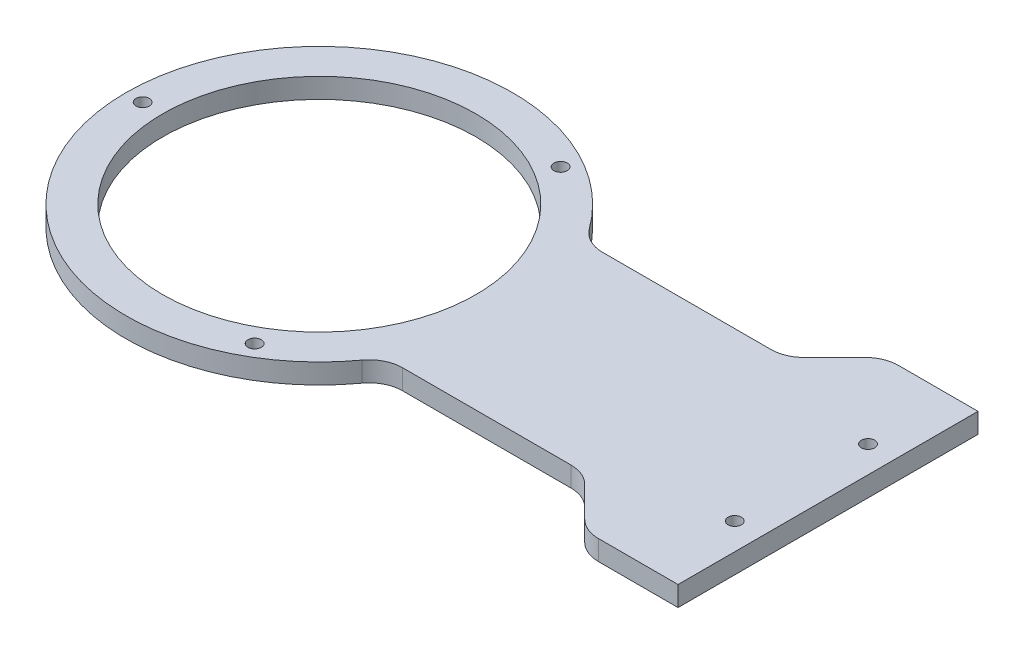
ISO-10303-21;
HEADER;
FILE_DESCRIPTION(('STEP AP214'),'2;1');
FILE_NAME('part.step','',(''),(''),'','','');
FILE_SCHEMA(('AUTOMOTIVE_DESIGN { 1 0 10303 214 1 1 1 1 }'));
ENDSEC;
DATA;
#1=APPLICATION_CONTEXT('core data for automotive mechanical design processes');
#2=APPLICATION_PROTOCOL_DEFINITION('international standard','automotive_design',2000,#1);
#3=PRODUCT_CONTEXT('',#1,'mechanical');
#4=PRODUCT('Part','Part','',(#3));
#5=PRODUCT_RELATED_PRODUCT_CATEGORY('part','',(#4));
#6=PRODUCT_DEFINITION_FORMATION('','',#4);
#7=PRODUCT_DEFINITION_CONTEXT('part definition',#1,'design');
#8=PRODUCT_DEFINITION('design','',#6,#7);
#9=PRODUCT_DEFINITION_SHAPE('','',#8);
#10=(LENGTH_UNIT() NAMED_UNIT(*) SI_UNIT(.MILLI.,.METRE.));
#11=(NAMED_UNIT(*) PLANE_ANGLE_UNIT() SI_UNIT($,.RADIAN.));
#12=(NAMED_UNIT(*) SI_UNIT($,.STERADIAN.) SOLID_ANGLE_UNIT());
#13=UNCERTAINTY_MEASURE_WITH_UNIT(LENGTH_MEASURE(1.E-05),#10,'distance_accuracy_value','');
#14=(GEOMETRIC_REPRESENTATION_CONTEXT(3) GLOBAL_UNCERTAINTY_ASSIGNED_CONTEXT((#13)) GLOBAL_UNIT_ASSIGNED_CONTEXT((#10,
#11,#12)) REPRESENTATION_CONTEXT('',''));
#15=CARTESIAN_POINT('',(0.,0.,0.));
#16=DIRECTION('',(0.,0.,1.));
#17=DIRECTION('',(1.,0.,0.));
#18=AXIS2_PLACEMENT_3D('',#15,#16,#17);
#19=CARTESIAN_POINT('',(0.,3.,-15.));
#20=DIRECTION('',(0.,0.,-1.));
#21=DIRECTION('',(-1.,0.,0.));
#22=AXIS2_PLACEMENT_3D('',#19,#20,#21);
#23=PLANE('',#22);
#24=DIRECTION('',(1.,0.,0.));
#25=VECTOR('',#24,1.);
#26=CARTESIAN_POINT('',(0.,0.,-15.));
#27=LINE('',#26,#25);
#28=CARTESIAN_POINT('',(27.495454169735,0.,-15.));
#29=VERTEX_POINT('',#28);
#30=CARTESIAN_POINT('',(52.7482794801162,0.,-15.));
#31=VERTEX_POINT('',#30);
#32=EDGE_CURVE('E199',#29,#31,#27,.T.);
#33=ORIENTED_EDGE('',*,*,#32,.F.);
#34=DIRECTION('',(0.,-1.,0.));
#35=VECTOR('',#34,1.);
#36=CARTESIAN_POINT('',(27.495454169735,3.,-15.));
#37=LINE('',#36,#35);
#38=CARTESIAN_POINT('',(27.495454169735,3.,-15.));
#39=VERTEX_POINT('',#38);
#40=EDGE_CURVE('E253',#29,#39,#37,.F.);
#41=ORIENTED_EDGE('',*,*,#40,.T.);
#42=DIRECTION('',(1.,0.,0.));
#43=VECTOR('',#42,1.);
#44=CARTESIAN_POINT('',(0.,3.,-15.));
#45=LINE('',#44,#43);
#46=CARTESIAN_POINT('',(52.7482794801162,3.,-15.));
#47=VERTEX_POINT('',#46);
#48=EDGE_CURVE('E240',#39,#47,#45,.T.);
#49=ORIENTED_EDGE('',*,*,#48,.T.);
#50=DIRECTION('',(0.,-1.,0.));
#51=VECTOR('',#50,1.);
#52=CARTESIAN_POINT('',(52.7482794801162,0.,-15.));
#53=LINE('',#52,#51);
#54=EDGE_CURVE('E249',#47,#31,#53,.T.);
#55=ORIENTED_EDGE('',*,*,#54,.T.);
#56=EDGE_LOOP('',(#33,#41,#49,#55));
#57=FACE_BOUND('',#56,.T.);
#58=ADVANCED_FACE('F45',(#57),#23,.T.);
#59=CARTESIAN_POINT('',(0.,3.,0.));
#60=DIRECTION('',(0.,-1.,0.));
#61=DIRECTION('',(0.,0.,-1.));
#62=AXIS2_PLACEMENT_3D('',#59,#60,#61);
#63=CYLINDRICAL_SURFACE('',#62,29.);
#64=CARTESIAN_POINT('',(0.,3.,0.));
#65=DIRECTION('',(0.,1.,0.));
#66=DIRECTION('',(0.,0.,1.));
#67=AXIS2_PLACEMENT_3D('',#64,#65,#66);
#68=CIRCLE('',#67,29.);
#69=CARTESIAN_POINT('',(23.4520050271269,3.,-17.0588235294118));
#70=VERTEX_POINT('',#69);
#71=CARTESIAN_POINT('',(23.4520050271269,3.,17.0588235294118));
#72=VERTEX_POINT('',#71);
#73=EDGE_CURVE('E331',#70,#72,#68,.T.);
#74=ORIENTED_EDGE('',*,*,#73,.F.);
#75=DIRECTION('',(0.,-1.,0.));
#76=VECTOR('',#75,1.);
#77=CARTESIAN_POINT('',(23.4520050271269,3.,-17.0588235294118));
#78=LINE('',#77,#76);
#79=CARTESIAN_POINT('',(23.4520050271269,0.,-17.0588235294118));
#80=VERTEX_POINT('',#79);
#81=EDGE_CURVE('E245',#70,#80,#78,.T.);
#82=ORIENTED_EDGE('',*,*,#81,.T.);
#83=CARTESIAN_POINT('',(0.,0.,0.));
#84=DIRECTION('',(0.,1.,0.));
#85=DIRECTION('',(0.,0.,1.));
#86=AXIS2_PLACEMENT_3D('',#83,#84,#85);
#87=CIRCLE('',#86,29.);
#88=CARTESIAN_POINT('',(23.4520050271269,0.,17.0588235294118));
#89=VERTEX_POINT('',#88);
#90=EDGE_CURVE('E203',#80,#89,#87,.T.);
#91=ORIENTED_EDGE('',*,*,#90,.T.);
#92=DIRECTION('',(0.,-1.,0.));
#93=VECTOR('',#92,1.);
#94=CARTESIAN_POINT('',(23.4520050271269,3.,17.0588235294118));
#95=LINE('',#94,#93);
#96=EDGE_CURVE('E161',#89,#72,#95,.F.);
#97=ORIENTED_EDGE('',*,*,#96,.T.);
#98=EDGE_LOOP('',(#74,#82,#91,#97));
#99=FACE_BOUND('',#98,.T.);
#100=ADVANCED_FACE('F387',(#99),#63,.T.);
#101=CARTESIAN_POINT('',(0.,3.,15.));
#102=DIRECTION('',(0.,0.,-1.));
#103=DIRECTION('',(-1.,0.,0.));
#104=AXIS2_PLACEMENT_3D('',#101,#102,#103);
#105=PLANE('',#104);
#106=DIRECTION('',(1.,0.,0.));
#107=VECTOR('',#106,1.);
#108=CARTESIAN_POINT('',(0.,3.,15.));
#109=LINE('',#108,#107);
#110=CARTESIAN_POINT('',(27.495454169735,3.,15.));
#111=VERTEX_POINT('',#110);
#112=CARTESIAN_POINT('',(52.7482794801163,3.,15.));
#113=VERTEX_POINT('',#112);
#114=EDGE_CURVE('E325',#111,#113,#109,.T.);
#115=ORIENTED_EDGE('',*,*,#114,.F.);
#116=DIRECTION('',(0.,1.,0.));
#117=VECTOR('',#116,1.);
#118=CARTESIAN_POINT('',(27.495454169735,0.,15.));
#119=LINE('',#118,#117);
#120=CARTESIAN_POINT('',(27.495454169735,0.,15.));
#121=VERTEX_POINT('',#120);
#122=EDGE_CURVE('E259',#111,#121,#119,.F.);
#123=ORIENTED_EDGE('',*,*,#122,.T.);
#124=DIRECTION('',(1.,0.,0.));
#125=VECTOR('',#124,1.);
#126=CARTESIAN_POINT('',(0.,0.,15.));
#127=LINE('',#126,#125);
#128=CARTESIAN_POINT('',(52.7482794801163,0.,15.));
#129=VERTEX_POINT('',#128);
#130=EDGE_CURVE('E208',#121,#129,#127,.T.);
#131=ORIENTED_EDGE('',*,*,#130,.T.);
#132=DIRECTION('',(0.,-1.,0.));
#133=VECTOR('',#132,1.);
#134=CARTESIAN_POINT('',(52.7482794801163,3.,15.));
#135=LINE('',#134,#133);
#136=EDGE_CURVE('E256',#129,#113,#135,.F.);
#137=ORIENTED_EDGE('',*,*,#136,.T.);
#138=EDGE_LOOP('',(#115,#123,#131,#137));
#139=FACE_BOUND('',#138,.T.);
#140=ADVANCED_FACE('F320',(#139),#105,.F.);
#141=CARTESIAN_POINT('',(19.9096736459906,3.,-19.9096736459908));
#142=DIRECTION('',(-0.707106781186544,0.,0.707106781186551));
#143=DIRECTION('',(0.707106781186551,0.,0.707106781186544));
#144=AXIS2_PLACEMENT_3D('',#141,#142,#143);
#145=PLANE('',#144);
#146=DIRECTION('',(-0.707106781186551,0.,-0.707106781186544));
#147=VECTOR('',#146,1.);
#148=CARTESIAN_POINT('',(19.9096736459906,0.,-19.9096736459908));
#149=LINE('',#148,#147);
#150=CARTESIAN_POINT('',(60.8548811979145,0.,21.0355339059327));
#151=VERTEX_POINT('',#150);
#152=CARTESIAN_POINT('',(56.283813386049,0.,16.4644660940673));
#153=VERTEX_POINT('',#152);
#154=EDGE_CURVE('E212',#151,#153,#149,.T.);
#155=ORIENTED_EDGE('',*,*,#154,.F.);
#156=DIRECTION('',(0.,-1.,0.));
#157=VECTOR('',#156,1.);
#158=CARTESIAN_POINT('',(60.8548811979145,3.,21.0355339059327));
#159=LINE('',#158,#157);
#160=CARTESIAN_POINT('',(60.8548811979145,3.,21.0355339059327));
#161=VERTEX_POINT('',#160);
#162=EDGE_CURVE('E276',#151,#161,#159,.F.);
#163=ORIENTED_EDGE('',*,*,#162,.T.);
#164=DIRECTION('',(-0.707106781186551,0.,-0.707106781186544));
#165=VECTOR('',#164,1.);
#166=CARTESIAN_POINT('',(19.9096736459906,3.,-19.9096736459908));
#167=LINE('',#166,#165);
#168=CARTESIAN_POINT('',(56.283813386049,3.,16.4644660940673));
#169=VERTEX_POINT('',#168);
#170=EDGE_CURVE('E172',#161,#169,#167,.T.);
#171=ORIENTED_EDGE('',*,*,#170,.T.);
#172=DIRECTION('',(0.,-1.,0.));
#173=VECTOR('',#172,1.);
#174=CARTESIAN_POINT('',(56.283813386049,3.,16.4644660940672));
#175=LINE('',#174,#173);
#176=EDGE_CURVE('E272',#169,#153,#175,.T.);
#177=ORIENTED_EDGE('',*,*,#176,.T.);
#178=EDGE_LOOP('',(#155,#163,#171,#177));
#179=FACE_BOUND('',#178,.T.);
#180=ADVANCED_FACE('F327',(#179),#145,.T.);
#181=CARTESIAN_POINT('',(0.,3.,22.5));
#182=DIRECTION('',(0.,0.,1.));
#183=DIRECTION('',(1.,0.,0.));
#184=AXIS2_PLACEMENT_3D('',#181,#182,#183);
#185=PLANE('',#184);
#186=DIRECTION('',(-1.,0.,0.));
#187=VECTOR('',#186,1.);
#188=CARTESIAN_POINT('',(0.,3.,22.5));
#189=LINE('',#188,#187);
#190=CARTESIAN_POINT('',(76.3193472919817,3.,22.4999999999999));
#191=VERTEX_POINT('',#190);
#192=CARTESIAN_POINT('',(64.3904151038472,3.,22.4999999999999));
#193=VERTEX_POINT('',#192);
#194=EDGE_CURVE('E152',#191,#193,#189,.T.);
#195=ORIENTED_EDGE('',*,*,#194,.T.);
#196=DIRECTION('',(0.,-1.,0.));
#197=VECTOR('',#196,1.);
#198=CARTESIAN_POINT('',(64.3904151038472,3.,22.4999999999999));
#199=LINE('',#198,#197);
#200=CARTESIAN_POINT('',(64.3904151038472,0.,22.4999999999999));
#201=VERTEX_POINT('',#200);
#202=EDGE_CURVE('E263',#193,#201,#199,.T.);
#203=ORIENTED_EDGE('',*,*,#202,.T.);
#204=DIRECTION('',(-1.,0.,0.));
#205=VECTOR('',#204,1.);
#206=CARTESIAN_POINT('',(0.,0.,22.5));
#207=LINE('',#206,#205);
#208=CARTESIAN_POINT('',(76.3193472919817,0.,22.4999999999999));
#209=VERTEX_POINT('',#208);
#210=EDGE_CURVE('E155',#209,#201,#207,.T.);
#211=ORIENTED_EDGE('',*,*,#210,.F.);
#212=DIRECTION('',(0.,-1.,0.));
#213=VECTOR('',#212,1.);
#214=CARTESIAN_POINT('',(76.3193472919817,3.,22.4999999999999));
#215=LINE('',#214,#213);
#216=EDGE_CURVE('E148',#191,#209,#215,.T.);
#217=ORIENTED_EDGE('',*,*,#216,.F.);
#218=EDGE_LOOP('',(#195,#203,#211,#217));
#219=FACE_BOUND('',#218,.T.);
#220=ADVANCED_FACE('F150',(#219),#185,.T.);
#221=CARTESIAN_POINT('',(76.3193472919817,3.,0.));
#222=DIRECTION('',(1.,0.,0.));
#223=DIRECTION('',(0.,0.,-1.));
#224=AXIS2_PLACEMENT_3D('',#221,#222,#223);
#225=PLANE('',#224);
#226=DIRECTION('',(0.,0.,1.));
#227=VECTOR('',#226,1.);
#228=CARTESIAN_POINT('',(76.3193472919817,0.,0.));
#229=LINE('',#228,#227);
#230=CARTESIAN_POINT('',(76.3193472919818,0.,-22.5000000000001));
#231=VERTEX_POINT('',#230);
#232=EDGE_CURVE('E218',#231,#209,#229,.T.);
#233=ORIENTED_EDGE('',*,*,#232,.F.);
#234=DIRECTION('',(0.,-1.,0.));
#235=VECTOR('',#234,1.);
#236=CARTESIAN_POINT('',(76.3193472919818,3.,-22.5000000000001));
#237=LINE('',#236,#235);
#238=CARTESIAN_POINT('',(76.3193472919818,3.,-22.5000000000001));
#239=VERTEX_POINT('',#238);
#240=EDGE_CURVE('E162',#239,#231,#237,.T.);
#241=ORIENTED_EDGE('',*,*,#240,.F.);
#242=DIRECTION('',(0.,0.,1.));
#243=VECTOR('',#242,1.);
#244=CARTESIAN_POINT('',(76.3193472919817,3.,0.));
#245=LINE('',#244,#243);
#246=EDGE_CURVE('E168',#239,#191,#245,.T.);
#247=ORIENTED_EDGE('',*,*,#246,.T.);
#248=ORIENTED_EDGE('',*,*,#216,.T.);
#249=EDGE_LOOP('',(#233,#241,#247,#248));
#250=FACE_BOUND('',#249,.T.);
#251=ADVANCED_FACE('F175',(#250),#225,.T.);
#252=CARTESIAN_POINT('',(0.,3.,-22.5));
#253=DIRECTION('',(0.,0.,-1.));
#254=DIRECTION('',(-1.,0.,0.));
#255=AXIS2_PLACEMENT_3D('',#252,#253,#254);
#256=PLANE('',#255);
#257=DIRECTION('',(1.,0.,0.));
#258=VECTOR('',#257,1.);
#259=CARTESIAN_POINT('',(0.,0.,-22.5));
#260=LINE('',#259,#258);
#261=CARTESIAN_POINT('',(64.3904151038472,0.,-22.5000000000001));
#262=VERTEX_POINT('',#261);
#263=EDGE_CURVE('E221',#262,#231,#260,.T.);
#264=ORIENTED_EDGE('',*,*,#263,.F.);
#265=DIRECTION('',(0.,-1.,0.));
#266=VECTOR('',#265,1.);
#267=CARTESIAN_POINT('',(64.3904151038472,3.,-22.5000000000001));
#268=LINE('',#267,#266);
#269=CARTESIAN_POINT('',(64.3904151038472,3.,-22.5000000000001));
#270=VERTEX_POINT('',#269);
#271=EDGE_CURVE('E289',#262,#270,#268,.F.);
#272=ORIENTED_EDGE('',*,*,#271,.T.);
#273=DIRECTION('',(1.,0.,0.));
#274=VECTOR('',#273,1.);
#275=CARTESIAN_POINT('',(0.,3.,-22.5));
#276=LINE('',#275,#274);
#277=EDGE_CURVE('E178',#270,#239,#276,.T.);
#278=ORIENTED_EDGE('',*,*,#277,.T.);
#279=ORIENTED_EDGE('',*,*,#240,.T.);
#280=EDGE_LOOP('',(#264,#272,#278,#279));
#281=FACE_BOUND('',#280,.T.);
#282=ADVANCED_FACE('F432',(#281),#256,.T.);
#283=CARTESIAN_POINT('',(72.3193472919817,3.,-10.0000000000001));
#284=DIRECTION('',(0.,-1.,0.));
#285=DIRECTION('',(0.,0.,-1.));
#286=AXIS2_PLACEMENT_3D('',#283,#284,#285);
#287=CYLINDRICAL_SURFACE('',#286,0.999999999999998);
#288=CARTESIAN_POINT('',(72.3193472919817,3.,-10.0000000000001));
#289=DIRECTION('',(0.,1.,0.));
#290=DIRECTION('',(0.,0.,1.));
#291=AXIS2_PLACEMENT_3D('',#288,#289,#290);
#292=CIRCLE('',#291,0.999999999999998);
#293=CARTESIAN_POINT('',(72.3193472919817,3.,-9.00000000000006));
#294=VERTEX_POINT('',#293);
#295=EDGE_CURVE('E191',#294,#294,#292,.T.);
#296=ORIENTED_EDGE('',*,*,#295,.T.);
#297=EDGE_LOOP('',(#296));
#298=FACE_BOUND('',#297,.T.);
#299=CARTESIAN_POINT('',(72.3193472919817,0.,-10.0000000000001));
#300=DIRECTION('',(0.,1.,0.));
#301=DIRECTION('',(0.,0.,1.));
#302=AXIS2_PLACEMENT_3D('',#299,#300,#301);
#303=CIRCLE('',#302,0.999999999999998);
#304=CARTESIAN_POINT('',(72.3193472919817,0.,-9.00000000000006));
#305=VERTEX_POINT('',#304);
#306=EDGE_CURVE('E232',#305,#305,#303,.T.);
#307=ORIENTED_EDGE('',*,*,#306,.F.);
#308=EDGE_LOOP('',(#307));
#309=FACE_BOUND('',#308,.T.);
#310=ADVANCED_FACE('F434',(#298,#309),#287,.F.);
#311=CARTESIAN_POINT('',(0.,3.,0.));
#312=DIRECTION('',(0.,-1.,0.));
#313=DIRECTION('',(0.,0.,-1.));
#314=AXIS2_PLACEMENT_3D('',#311,#312,#313);
#315=CYLINDRICAL_SURFACE('',#314,23.5);
#316=CARTESIAN_POINT('',(0.,3.,0.));
#317=DIRECTION('',(0.,1.,0.));
#318=DIRECTION('',(0.,0.,1.));
#319=AXIS2_PLACEMENT_3D('',#316,#317,#318);
#320=CIRCLE('',#319,23.5);
#321=CARTESIAN_POINT('',(0.,3.,23.5));
#322=VERTEX_POINT('',#321);
#323=EDGE_CURVE('E187',#322,#322,#320,.T.);
#324=ORIENTED_EDGE('',*,*,#323,.T.);
#325=EDGE_LOOP('',(#324));
#326=FACE_BOUND('',#325,.T.);
#327=CARTESIAN_POINT('',(0.,0.,0.));
#328=DIRECTION('',(0.,1.,0.));
#329=DIRECTION('',(0.,0.,1.));
#330=AXIS2_PLACEMENT_3D('',#327,#328,#329);
#331=CIRCLE('',#330,23.5);
#332=CARTESIAN_POINT('',(0.,0.,23.5));
#333=VERTEX_POINT('',#332);
#334=EDGE_CURVE('E228',#333,#333,#331,.T.);
#335=ORIENTED_EDGE('',*,*,#334,.F.);
#336=EDGE_LOOP('',(#335));
#337=FACE_BOUND('',#336,.T.);
#338=ADVANCED_FACE('F440',(#326,#337),#315,.F.);
#339=CARTESIAN_POINT('',(19.9096736459909,3.,19.9096736459909));
#340=DIRECTION('',(-0.707106781186548,0.,-0.707106781186547));
#341=DIRECTION('',(-0.707106781186547,0.,0.707106781186548));
#342=AXIS2_PLACEMENT_3D('',#339,#340,#341);
#343=PLANE('',#342);
#344=DIRECTION('',(0.707106781186547,0.,-0.707106781186548));
#345=VECTOR('',#344,1.);
#346=CARTESIAN_POINT('',(19.9096736459909,3.,19.9096736459909));
#347=LINE('',#346,#345);
#348=CARTESIAN_POINT('',(56.283813386049,3.,-16.4644660940673));
#349=VERTEX_POINT('',#348);
#350=CARTESIAN_POINT('',(60.8548811979145,3.,-21.0355339059328));
#351=VERTEX_POINT('',#350);
#352=EDGE_CURVE('E181',#349,#351,#347,.T.);
#353=ORIENTED_EDGE('',*,*,#352,.T.);
#354=DIRECTION('',(0.,-1.,0.));
#355=VECTOR('',#354,1.);
#356=CARTESIAN_POINT('',(60.8548811979145,3.,-21.0355339059328));
#357=LINE('',#356,#355);
#358=CARTESIAN_POINT('',(60.8548811979145,0.,-21.0355339059328));
#359=VERTEX_POINT('',#358);
#360=EDGE_CURVE('E285',#351,#359,#357,.T.);
#361=ORIENTED_EDGE('',*,*,#360,.T.);
#362=DIRECTION('',(0.707106781186547,0.,-0.707106781186548));
#363=VECTOR('',#362,1.);
#364=CARTESIAN_POINT('',(19.9096736459909,0.,19.9096736459909));
#365=LINE('',#364,#363);
#366=CARTESIAN_POINT('',(56.283813386049,0.,-16.4644660940673));
#367=VERTEX_POINT('',#366);
#368=EDGE_CURVE('E224',#367,#359,#365,.T.);
#369=ORIENTED_EDGE('',*,*,#368,.F.);
#370=DIRECTION('',(0.,-1.,0.));
#371=VECTOR('',#370,1.);
#372=CARTESIAN_POINT('',(56.283813386049,3.,-16.4644660940673));
#373=LINE('',#372,#371);
#374=EDGE_CURVE('E68',#367,#349,#373,.F.);
#375=ORIENTED_EDGE('',*,*,#374,.T.);
#376=EDGE_LOOP('',(#353,#361,#369,#375));
#377=FACE_BOUND('',#376,.T.);
#378=ADVANCED_FACE('F427',(#377),#343,.T.);
#379=CARTESIAN_POINT('',(72.3193472919817,3.,10.0000000000001));
#380=DIRECTION('',(0.,-1.,0.));
#381=DIRECTION('',(0.,0.,-1.));
#382=AXIS2_PLACEMENT_3D('',#379,#380,#381);
#383=CYLINDRICAL_SURFACE('',#382,0.999999999999998);
#384=CARTESIAN_POINT('',(72.3193472919817,3.,10.0000000000001));
#385=DIRECTION('',(0.,1.,0.));
#386=DIRECTION('',(0.,0.,1.));
#387=AXIS2_PLACEMENT_3D('',#384,#385,#386);
#388=CIRCLE('',#387,0.999999999999998);
#389=CARTESIAN_POINT('',(72.3193472919817,3.,11.0000000000001));
#390=VERTEX_POINT('',#389);
#391=EDGE_CURVE('E195',#390,#390,#388,.F.);
#392=ORIENTED_EDGE('',*,*,#391,.F.);
#393=EDGE_LOOP('',(#392));
#394=FACE_BOUND('',#393,.T.);
#395=CARTESIAN_POINT('',(72.3193472919817,0.,10.0000000000001));
#396=DIRECTION('',(0.,1.,0.));
#397=DIRECTION('',(0.,0.,1.));
#398=AXIS2_PLACEMENT_3D('',#395,#396,#397);
#399=CIRCLE('',#398,0.999999999999998);
#400=CARTESIAN_POINT('',(72.3193472919817,0.,11.0000000000001));
#401=VERTEX_POINT('',#400);
#402=EDGE_CURVE('E236',#401,#401,#399,.F.);
#403=ORIENTED_EDGE('',*,*,#402,.T.);
#404=EDGE_LOOP('',(#403));
#405=FACE_BOUND('',#404,.T.);
#406=ADVANCED_FACE('F368',(#394,#405),#383,.F.);
#407=CARTESIAN_POINT('',(0.,3.,0.));
#408=DIRECTION('',(0.,1.,0.));
#409=DIRECTION('',(0.,0.,1.));
#410=AXIS2_PLACEMENT_3D('',#407,#408,#409);
#411=PLANE('',#410);
#412=CARTESIAN_POINT('',(-26.5,3.,1.92554305833426E-13));
#413=DIRECTION('',(0.,1.,0.));
#414=DIRECTION('',(0.866025403784436,0.,-0.500000000000004));
#415=AXIS2_PLACEMENT_3D('',#412,#413,#414);
#416=CIRCLE('',#415,1.);
#417=CARTESIAN_POINT('',(-25.6339745962156,3.,-0.499999999999812));
#418=VERTEX_POINT('',#417);
#419=EDGE_CURVE('E352',#418,#418,#416,.T.);
#420=ORIENTED_EDGE('',*,*,#419,.F.);
#421=EDGE_LOOP('',(#420));
#422=FACE_BOUND('',#421,.T.);
#423=CARTESIAN_POINT('',(13.2500000000003,3.,22.9496732002875));
#424=DIRECTION('',(0.,1.,0.));
#425=DIRECTION('',(-0.866025403784443,0.,-0.499999999999992));
#426=AXIS2_PLACEMENT_3D('',#423,#424,#425);
#427=CIRCLE('',#426,1.);
#428=CARTESIAN_POINT('',(13.2500000000003,3.,23.9496732002875));
#429=VERTEX_POINT('',#428);
#430=EDGE_CURVE('E353',#429,#429,#427,.T.);
#431=ORIENTED_EDGE('',*,*,#430,.F.);
#432=EDGE_LOOP('',(#431));
#433=FACE_BOUND('',#432,.T.);
#434=CARTESIAN_POINT('',(13.2499999999999,3.,-22.9496732002877));
#435=DIRECTION('',(0.,1.,0.));
#436=DIRECTION('',(0.,0.,1.));
#437=AXIS2_PLACEMENT_3D('',#434,#435,#436);
#438=CIRCLE('',#437,1.);
#439=CARTESIAN_POINT('',(13.2499999999999,3.,-21.9496732002877));
#440=VERTEX_POINT('',#439);
#441=EDGE_CURVE('E343',#440,#440,#438,.T.);
#442=ORIENTED_EDGE('',*,*,#441,.F.);
#443=EDGE_LOOP('',(#442));
#444=FACE_BOUND('',#443,.T.);
#445=ORIENTED_EDGE('',*,*,#170,.F.);
#446=CARTESIAN_POINT('',(64.3904151038472,3.,17.4999999999999));
#447=DIRECTION('',(0.,1.,0.));
#448=DIRECTION('',(0.,0.,1.));
#449=AXIS2_PLACEMENT_3D('',#446,#447,#448);
#450=CIRCLE('',#449,5.);
#451=EDGE_CURVE('E170',#161,#193,#450,.T.);
#452=ORIENTED_EDGE('',*,*,#451,.T.);
#453=ORIENTED_EDGE('',*,*,#194,.F.);
#454=ORIENTED_EDGE('',*,*,#246,.F.);
#455=ORIENTED_EDGE('',*,*,#277,.F.);
#456=CARTESIAN_POINT('',(64.3904151038472,3.,-17.5000000000001));
#457=DIRECTION('',(0.,1.,0.));
#458=DIRECTION('',(0.,0.,1.));
#459=AXIS2_PLACEMENT_3D('',#456,#457,#458);
#460=CIRCLE('',#459,5.);
#461=EDGE_CURVE('E61',#270,#351,#460,.T.);
#462=ORIENTED_EDGE('',*,*,#461,.T.);
#463=ORIENTED_EDGE('',*,*,#352,.F.);
#464=CARTESIAN_POINT('',(52.7482794801162,3.,-20.));
#465=DIRECTION('',(0.,1.,0.));
#466=DIRECTION('',(0.,0.,1.));
#467=AXIS2_PLACEMENT_3D('',#464,#465,#466);
#468=CIRCLE('',#467,5.);
#469=EDGE_CURVE('E307',#349,#47,#468,.F.);
#470=ORIENTED_EDGE('',*,*,#469,.T.);
#471=ORIENTED_EDGE('',*,*,#48,.F.);
#472=CARTESIAN_POINT('',(27.495454169735,3.,-20.));
#473=DIRECTION('',(0.,1.,0.));
#474=DIRECTION('',(0.,0.,1.));
#475=AXIS2_PLACEMENT_3D('',#472,#473,#474);
#476=CIRCLE('',#475,5.);
#477=EDGE_CURVE('E295',#39,#70,#476,.F.);
#478=ORIENTED_EDGE('',*,*,#477,.T.);
#479=ORIENTED_EDGE('',*,*,#73,.T.);
#480=CARTESIAN_POINT('',(27.495454169735,3.,20.));
#481=DIRECTION('',(0.,1.,0.));
#482=DIRECTION('',(0.,0.,1.));
#483=AXIS2_PLACEMENT_3D('',#480,#481,#482);
#484=CIRCLE('',#483,5.);
#485=EDGE_CURVE('E301',#72,#111,#484,.F.);
#486=ORIENTED_EDGE('',*,*,#485,.T.);
#487=ORIENTED_EDGE('',*,*,#114,.T.);
#488=CARTESIAN_POINT('',(52.7482794801163,3.,20.));
#489=DIRECTION('',(0.,1.,0.));
#490=DIRECTION('',(0.,0.,1.));
#491=AXIS2_PLACEMENT_3D('',#488,#489,#490);
#492=CIRCLE('',#491,5.);
#493=EDGE_CURVE('E11',#113,#169,#492,.F.);
#494=ORIENTED_EDGE('',*,*,#493,.T.);
#495=EDGE_LOOP('',(#445,#452,#453,#454,#455,#462,#463,#470,#471,#478,#479,#486,#487,#494));
#496=FACE_BOUND('',#495,.T.);
#497=ORIENTED_EDGE('',*,*,#323,.F.);
#498=EDGE_LOOP('',(#497));
#499=FACE_BOUND('',#498,.T.);
#500=ORIENTED_EDGE('',*,*,#295,.F.);
#501=EDGE_LOOP('',(#500));
#502=FACE_BOUND('',#501,.T.);
#503=ORIENTED_EDGE('',*,*,#391,.T.);
#504=EDGE_LOOP('',(#503));
#505=FACE_BOUND('',#504,.T.);
#506=ADVANCED_FACE('F166',(#422,#433,#444,#496,#499,#502,#505),#411,.T.);
#507=CARTESIAN_POINT('',(0.,0.,0.));
#508=DIRECTION('',(0.,1.,0.));
#509=DIRECTION('',(0.,0.,1.));
#510=AXIS2_PLACEMENT_3D('',#507,#508,#509);
#511=PLANE('',#510);
#512=CARTESIAN_POINT('',(-26.5,0.,1.92554305833426E-13));
#513=DIRECTION('',(0.,1.,0.));
#514=DIRECTION('',(0.,0.,1.));
#515=AXIS2_PLACEMENT_3D('',#512,#513,#514);
#516=CIRCLE('',#515,1.);
#517=CARTESIAN_POINT('',(-26.5,0.,1.00000000000019));
#518=VERTEX_POINT('',#517);
#519=EDGE_CURVE('E347',#518,#518,#516,.F.);
#520=ORIENTED_EDGE('',*,*,#519,.F.);
#521=EDGE_LOOP('',(#520));
#522=FACE_BOUND('',#521,.T.);
#523=CARTESIAN_POINT('',(13.2500000000003,0.,22.9496732002875));
#524=DIRECTION('',(0.,1.,0.));
#525=DIRECTION('',(0.,0.,1.));
#526=AXIS2_PLACEMENT_3D('',#523,#524,#525);
#527=CIRCLE('',#526,1.);
#528=CARTESIAN_POINT('',(13.2500000000003,0.,23.9496732002875));
#529=VERTEX_POINT('',#528);
#530=EDGE_CURVE('E348',#529,#529,#527,.F.);
#531=ORIENTED_EDGE('',*,*,#530,.F.);
#532=EDGE_LOOP('',(#531));
#533=FACE_BOUND('',#532,.T.);
#534=CARTESIAN_POINT('',(13.2499999999999,0.,-22.9496732002877));
#535=DIRECTION('',(0.,1.,0.));
#536=DIRECTION('',(0.,0.,1.));
#537=AXIS2_PLACEMENT_3D('',#534,#535,#536);
#538=CIRCLE('',#537,1.);
#539=CARTESIAN_POINT('',(13.2499999999999,0.,-21.9496732002877));
#540=VERTEX_POINT('',#539);
#541=EDGE_CURVE('E204',#540,#540,#538,.F.);
#542=ORIENTED_EDGE('',*,*,#541,.F.);
#543=EDGE_LOOP('',(#542));
#544=FACE_BOUND('',#543,.T.);
#545=ORIENTED_EDGE('',*,*,#210,.T.);
#546=CARTESIAN_POINT('',(64.3904151038472,0.,17.4999999999999));
#547=DIRECTION('',(0.,1.,0.));
#548=DIRECTION('',(0.,0.,1.));
#549=AXIS2_PLACEMENT_3D('',#546,#547,#548);
#550=CIRCLE('',#549,5.);
#551=EDGE_CURVE('E269',#201,#151,#550,.F.);
#552=ORIENTED_EDGE('',*,*,#551,.T.);
#553=ORIENTED_EDGE('',*,*,#154,.T.);
#554=CARTESIAN_POINT('',(52.7482794801163,0.,20.));
#555=DIRECTION('',(0.,1.,0.));
#556=DIRECTION('',(0.,0.,1.));
#557=AXIS2_PLACEMENT_3D('',#554,#555,#556);
#558=CIRCLE('',#557,5.);
#559=EDGE_CURVE('E54',#153,#129,#558,.T.);
#560=ORIENTED_EDGE('',*,*,#559,.T.);
#561=ORIENTED_EDGE('',*,*,#130,.F.);
#562=CARTESIAN_POINT('',(27.495454169735,0.,20.));
#563=DIRECTION('',(0.,1.,0.));
#564=DIRECTION('',(0.,0.,1.));
#565=AXIS2_PLACEMENT_3D('',#562,#563,#564);
#566=CIRCLE('',#565,5.);
#567=EDGE_CURVE('E298',#121,#89,#566,.T.);
#568=ORIENTED_EDGE('',*,*,#567,.T.);
#569=ORIENTED_EDGE('',*,*,#90,.F.);
#570=CARTESIAN_POINT('',(27.495454169735,0.,-20.));
#571=DIRECTION('',(0.,1.,0.));
#572=DIRECTION('',(0.,0.,1.));
#573=AXIS2_PLACEMENT_3D('',#570,#571,#572);
#574=CIRCLE('',#573,5.);
#575=EDGE_CURVE('E292',#80,#29,#574,.T.);
#576=ORIENTED_EDGE('',*,*,#575,.T.);
#577=ORIENTED_EDGE('',*,*,#32,.T.);
#578=CARTESIAN_POINT('',(52.7482794801162,0.,-20.));
#579=DIRECTION('',(0.,1.,0.));
#580=DIRECTION('',(0.,0.,1.));
#581=AXIS2_PLACEMENT_3D('',#578,#579,#580);
#582=CIRCLE('',#581,5.);
#583=EDGE_CURVE('E304',#31,#367,#582,.T.);
#584=ORIENTED_EDGE('',*,*,#583,.T.);
#585=ORIENTED_EDGE('',*,*,#368,.T.);
#586=CARTESIAN_POINT('',(64.3904151038472,0.,-17.5000000000001));
#587=DIRECTION('',(0.,1.,0.));
#588=DIRECTION('',(0.,0.,1.));
#589=AXIS2_PLACEMENT_3D('',#586,#587,#588);
#590=CIRCLE('',#589,5.);
#591=EDGE_CURVE('E266',#359,#262,#590,.F.);
#592=ORIENTED_EDGE('',*,*,#591,.T.);
#593=ORIENTED_EDGE('',*,*,#263,.T.);
#594=ORIENTED_EDGE('',*,*,#232,.T.);
#595=EDGE_LOOP('',(#545,#552,#553,#560,#561,#568,#569,#576,#577,#584,#585,#592,#593,#594));
#596=FACE_BOUND('',#595,.T.);
#597=ORIENTED_EDGE('',*,*,#334,.T.);
#598=EDGE_LOOP('',(#597));
#599=FACE_BOUND('',#598,.T.);
#600=ORIENTED_EDGE('',*,*,#306,.T.);
#601=EDGE_LOOP('',(#600));
#602=FACE_BOUND('',#601,.T.);
#603=ORIENTED_EDGE('',*,*,#402,.F.);
#604=EDGE_LOOP('',(#603));
#605=FACE_BOUND('',#604,.T.);
#606=ADVANCED_FACE('F312',(#522,#533,#544,#596,#599,#602,#605),#511,.F.);
#607=CARTESIAN_POINT('',(27.495454169735,3.,-20.));
#608=DIRECTION('',(0.,-1.,0.));
#609=DIRECTION('',(0.,0.,-1.));
#610=AXIS2_PLACEMENT_3D('',#607,#608,#609);
#611=CYLINDRICAL_SURFACE('',#610,5.);
#612=ORIENTED_EDGE('',*,*,#477,.F.);
#613=ORIENTED_EDGE('',*,*,#40,.F.);
#614=ORIENTED_EDGE('',*,*,#575,.F.);
#615=ORIENTED_EDGE('',*,*,#81,.F.);
#616=EDGE_LOOP('',(#612,#613,#614,#615));
#617=FACE_BOUND('',#616,.T.);
#618=ADVANCED_FACE('F398',(#617),#611,.F.);
#619=CARTESIAN_POINT('',(27.495454169735,3.,20.));
#620=DIRECTION('',(0.,-1.,0.));
#621=DIRECTION('',(0.,0.,-1.));
#622=AXIS2_PLACEMENT_3D('',#619,#620,#621);
#623=CYLINDRICAL_SURFACE('',#622,5.);
#624=ORIENTED_EDGE('',*,*,#485,.F.);
#625=ORIENTED_EDGE('',*,*,#96,.F.);
#626=ORIENTED_EDGE('',*,*,#567,.F.);
#627=ORIENTED_EDGE('',*,*,#122,.F.);
#628=EDGE_LOOP('',(#624,#625,#626,#627));
#629=FACE_BOUND('',#628,.T.);
#630=ADVANCED_FACE('F401',(#629),#623,.F.);
#631=CARTESIAN_POINT('',(64.3904151038472,3.,17.4999999999999));
#632=DIRECTION('',(0.,-1.,0.));
#633=DIRECTION('',(0.,0.,-1.));
#634=AXIS2_PLACEMENT_3D('',#631,#632,#633);
#635=CYLINDRICAL_SURFACE('',#634,5.);
#636=ORIENTED_EDGE('',*,*,#451,.F.);
#637=ORIENTED_EDGE('',*,*,#162,.F.);
#638=ORIENTED_EDGE('',*,*,#551,.F.);
#639=ORIENTED_EDGE('',*,*,#202,.F.);
#640=EDGE_LOOP('',(#636,#637,#638,#639));
#641=FACE_BOUND('',#640,.T.);
#642=ADVANCED_FACE('F405',(#641),#635,.T.);
#643=CARTESIAN_POINT('',(64.3904151038472,3.,-17.5000000000001));
#644=DIRECTION('',(0.,-1.,0.));
#645=DIRECTION('',(0.,0.,-1.));
#646=AXIS2_PLACEMENT_3D('',#643,#644,#645);
#647=CYLINDRICAL_SURFACE('',#646,5.);
#648=ORIENTED_EDGE('',*,*,#461,.F.);
#649=ORIENTED_EDGE('',*,*,#271,.F.);
#650=ORIENTED_EDGE('',*,*,#591,.F.);
#651=ORIENTED_EDGE('',*,*,#360,.F.);
#652=EDGE_LOOP('',(#648,#649,#650,#651));
#653=FACE_BOUND('',#652,.T.);
#654=ADVANCED_FACE('F409',(#653),#647,.T.);
#655=CARTESIAN_POINT('',(52.7482794801162,3.,-20.));
#656=DIRECTION('',(0.,1.,0.));
#657=DIRECTION('',(0.,0.,1.));
#658=AXIS2_PLACEMENT_3D('',#655,#656,#657);
#659=CYLINDRICAL_SURFACE('',#658,5.);
#660=ORIENTED_EDGE('',*,*,#469,.F.);
#661=ORIENTED_EDGE('',*,*,#374,.F.);
#662=ORIENTED_EDGE('',*,*,#583,.F.);
#663=ORIENTED_EDGE('',*,*,#54,.F.);
#664=EDGE_LOOP('',(#660,#661,#662,#663));
#665=FACE_BOUND('',#664,.T.);
#666=ADVANCED_FACE('F385',(#665),#659,.F.);
#667=CARTESIAN_POINT('',(52.7482794801163,3.,20.));
#668=DIRECTION('',(0.,-1.,0.));
#669=DIRECTION('',(0.,0.,-1.));
#670=AXIS2_PLACEMENT_3D('',#667,#668,#669);
#671=CYLINDRICAL_SURFACE('',#670,5.);
#672=ORIENTED_EDGE('',*,*,#493,.F.);
#673=ORIENTED_EDGE('',*,*,#136,.F.);
#674=ORIENTED_EDGE('',*,*,#559,.F.);
#675=ORIENTED_EDGE('',*,*,#176,.F.);
#676=EDGE_LOOP('',(#672,#673,#674,#675));
#677=FACE_BOUND('',#676,.T.);
#678=ADVANCED_FACE('F47',(#677),#671,.F.);
#679=CARTESIAN_POINT('',(13.2499999999999,-2.8284271247462,-22.9496732002877));
#680=DIRECTION('',(0.,1.,0.));
#681=DIRECTION('',(0.,0.,1.));
#682=AXIS2_PLACEMENT_3D('',#679,#680,#681);
#683=CYLINDRICAL_SURFACE('',#682,1.);
#684=ORIENTED_EDGE('',*,*,#541,.T.);
#685=EDGE_LOOP('',(#684));
#686=FACE_BOUND('',#685,.T.);
#687=ORIENTED_EDGE('',*,*,#441,.T.);
#688=EDGE_LOOP('',(#687));
#689=FACE_BOUND('',#688,.T.);
#690=ADVANCED_FACE('F374',(#686,#689),#683,.F.);
#691=CARTESIAN_POINT('',(13.2500000000003,-2.82842712474619,22.9496732002875));
#692=DIRECTION('',(0.,1.,0.));
#693=DIRECTION('',(0.,0.,1.));
#694=AXIS2_PLACEMENT_3D('',#691,#692,#693);
#695=CYLINDRICAL_SURFACE('',#694,1.);
#696=CARTESIAN_POINT('',(13.2500000000003,0.,23.9496732002875));
#697=CARTESIAN_POINT('',(13.2500000000003,0.0312499999999996,23.9496732002875));
#698=CARTESIAN_POINT('',(13.2500000000003,0.0624999999999996,23.9496732002875));
#699=CARTESIAN_POINT('',(13.2500000000003,0.125,23.9496732002875));
#700=CARTESIAN_POINT('',(13.2500000000003,0.15625,23.9496732002875));
#701=CARTESIAN_POINT('',(13.2500000000003,0.21875,23.9496732002875));
#702=CARTESIAN_POINT('',(13.2500000000003,0.25,23.9496732002875));
#703=CARTESIAN_POINT('',(13.2500000000003,0.3125,23.9496732002875));
#704=CARTESIAN_POINT('',(13.2500000000003,0.34375,23.9496732002875));
#705=CARTESIAN_POINT('',(13.2500000000003,0.40625,23.9496732002875));
#706=CARTESIAN_POINT('',(13.2500000000003,0.4375,23.9496732002875));
#707=CARTESIAN_POINT('',(13.2500000000003,0.5,23.9496732002875));
#708=CARTESIAN_POINT('',(13.2500000000003,0.53125,23.9496732002875));
#709=CARTESIAN_POINT('',(13.2500000000003,0.59375,23.9496732002875));
#710=CARTESIAN_POINT('',(13.2500000000003,0.625,23.9496732002875));
#711=CARTESIAN_POINT('',(13.2500000000003,0.6875,23.9496732002875));
#712=CARTESIAN_POINT('',(13.2500000000003,0.71875,23.9496732002875));
#713=CARTESIAN_POINT('',(13.2500000000003,0.78125,23.9496732002875));
#714=CARTESIAN_POINT('',(13.2500000000003,0.8125,23.9496732002875));
#715=CARTESIAN_POINT('',(13.2500000000003,0.875,23.9496732002875));
#716=CARTESIAN_POINT('',(13.2500000000003,0.90625,23.9496732002875));
#717=CARTESIAN_POINT('',(13.2500000000003,0.96875,23.9496732002875));
#718=CARTESIAN_POINT('',(13.2500000000003,1.,23.9496732002875));
#719=CARTESIAN_POINT('',(13.2500000000003,1.0625,23.9496732002875));
#720=CARTESIAN_POINT('',(13.2500000000003,1.09375,23.9496732002875));
#721=CARTESIAN_POINT('',(13.2500000000003,1.15625,23.9496732002875));
#722=CARTESIAN_POINT('',(13.2500000000003,1.1875,23.9496732002875));
#723=CARTESIAN_POINT('',(13.2500000000003,1.25,23.9496732002875));
#724=CARTESIAN_POINT('',(13.2500000000003,1.28125,23.9496732002875));
#725=CARTESIAN_POINT('',(13.2500000000003,1.34375,23.9496732002875));
#726=CARTESIAN_POINT('',(13.2500000000003,1.375,23.9496732002875));
#727=CARTESIAN_POINT('',(13.2500000000003,1.4375,23.9496732002875));
#728=CARTESIAN_POINT('',(13.2500000000003,1.46875,23.9496732002875));
#729=CARTESIAN_POINT('',(13.2500000000003,1.53125,23.9496732002875));
#730=CARTESIAN_POINT('',(13.2500000000003,1.5625,23.9496732002875));
#731=CARTESIAN_POINT('',(13.2500000000003,1.625,23.9496732002875));
#732=CARTESIAN_POINT('',(13.2500000000003,1.65625,23.9496732002875));
#733=CARTESIAN_POINT('',(13.2500000000003,1.71875,23.9496732002875));
#734=CARTESIAN_POINT('',(13.2500000000003,1.75,23.9496732002875));
#735=CARTESIAN_POINT('',(13.2500000000003,1.8125,23.9496732002875));
#736=CARTESIAN_POINT('',(13.2500000000003,1.84375,23.9496732002875));
#737=CARTESIAN_POINT('',(13.2500000000003,1.90625,23.9496732002875));
#738=CARTESIAN_POINT('',(13.2500000000003,1.9375,23.9496732002875));
#739=CARTESIAN_POINT('',(13.2500000000003,2.,23.9496732002875));
#740=CARTESIAN_POINT('',(13.2500000000003,2.03125,23.9496732002875));
#741=CARTESIAN_POINT('',(13.2500000000003,2.09375,23.9496732002875));
#742=CARTESIAN_POINT('',(13.2500000000003,2.125,23.9496732002875));
#743=CARTESIAN_POINT('',(13.2500000000003,2.1875,23.9496732002875));
#744=CARTESIAN_POINT('',(13.2500000000003,2.21875,23.9496732002875));
#745=CARTESIAN_POINT('',(13.2500000000003,2.28125,23.9496732002875));
#746=CARTESIAN_POINT('',(13.2500000000003,2.3125,23.9496732002875));
#747=CARTESIAN_POINT('',(13.2500000000003,2.375,23.9496732002875));
#748=CARTESIAN_POINT('',(13.2500000000003,2.40625,23.9496732002875));
#749=CARTESIAN_POINT('',(13.2500000000003,2.46875,23.9496732002875));
#750=CARTESIAN_POINT('',(13.2500000000003,2.5,23.9496732002875));
#751=CARTESIAN_POINT('',(13.2500000000003,2.5625,23.9496732002875));
#752=CARTESIAN_POINT('',(13.2500000000003,2.59375,23.9496732002875));
#753=CARTESIAN_POINT('',(13.2500000000003,2.65625,23.9496732002875));
#754=CARTESIAN_POINT('',(13.2500000000003,2.6875,23.9496732002875));
#755=CARTESIAN_POINT('',(13.2500000000003,2.75,23.9496732002875));
#756=CARTESIAN_POINT('',(13.2500000000003,2.78125,23.9496732002875));
#757=CARTESIAN_POINT('',(13.2500000000003,2.84375,23.9496732002875));
#758=CARTESIAN_POINT('',(13.2500000000003,2.875,23.9496732002875));
#759=CARTESIAN_POINT('',(13.2500000000003,2.9375,23.9496732002875));
#760=CARTESIAN_POINT('',(13.2500000000003,2.96875,23.9496732002875));
#761=CARTESIAN_POINT('',(13.2500000000003,3.,23.9496732002875));
#762=B_SPLINE_CURVE_WITH_KNOTS('',3,(#696,#697,#698,#699,#700,#701,#702,#703,#704,#705,#706,
#707,#708,#709,#710,#711,#712,#713,#714,#715,#716,#717,#718,#719,#720,#721,#722,#723,#724,#725,
#726,#727,#728,#729,#730,#731,#732,#733,#734,#735,#736,#737,#738,#739,#740,#741,#742,#743,#744,
#745,#746,#747,#748,#749,#750,#751,#752,#753,#754,#755,#756,#757,#758,#759,#760,#761),
.UNSPECIFIED.,.F.,.F.,(4,2,2,2,2,2,2,2,2,2,2,2,2,2,2,2,2,2,2,2,2,2,2,2,2,2,2,2,2,2,2,2,4),(0.,
0.0937500000000001,0.1875,0.28125,0.375,0.46875,0.5625,0.65625,0.75,0.84375,0.9375,1.03125,
1.125,1.21875,1.3125,1.40625,1.5,1.59375,1.6875,1.78125,1.875,1.96875,2.0625,2.15625,2.25,
2.34375,2.4375,2.53125,2.625,2.71875,2.8125,2.90625,3.),.UNSPECIFIED.);
#763=EDGE_CURVE('BSEAM376',#529,#429,#762,.T.);
#764=ORIENTED_EDGE('',*,*,#530,.T.);
#765=ORIENTED_EDGE('',*,*,#430,.T.);
#766=ORIENTED_EDGE('',*,*,#763,.T.);
#767=ORIENTED_EDGE('',*,*,#763,.F.);
#768=EDGE_LOOP('',(#764,#766,#765,#767));
#769=FACE_BOUND('',#768,.T.);
#770=ADVANCED_FACE('F376',(#769),#695,.F.);
#771=CARTESIAN_POINT('',(-26.5,-2.82842712474619,1.92554305833426E-13));
#772=DIRECTION('',(0.,1.,0.));
#773=DIRECTION('',(0.,0.,1.));
#774=AXIS2_PLACEMENT_3D('',#771,#772,#773);
#775=CYLINDRICAL_SURFACE('',#774,1.);
#776=ORIENTED_EDGE('',*,*,#519,.T.);
#777=EDGE_LOOP('',(#776));
#778=FACE_BOUND('',#777,.T.);
#779=ORIENTED_EDGE('',*,*,#419,.T.);
#780=EDGE_LOOP('',(#779));
#781=FACE_BOUND('',#780,.T.);
#782=ADVANCED_FACE('F364',(#778,#781),#775,.F.);
#783=CLOSED_SHELL('',(#58,#100,#140,#180,#220,#251,#282,#310,#338,#378,#406,#506,#606,#618,#630,
#642,#654,#666,#678,#690,#770,#782));
#784=MANIFOLD_SOLID_BREP('B2',#783);
#785=ADVANCED_BREP_SHAPE_REPRESENTATION('',(#18,#784),#14);
#786=SHAPE_DEFINITION_REPRESENTATION(#9,#785);
ENDSEC;
END-ISO-10303-21;
